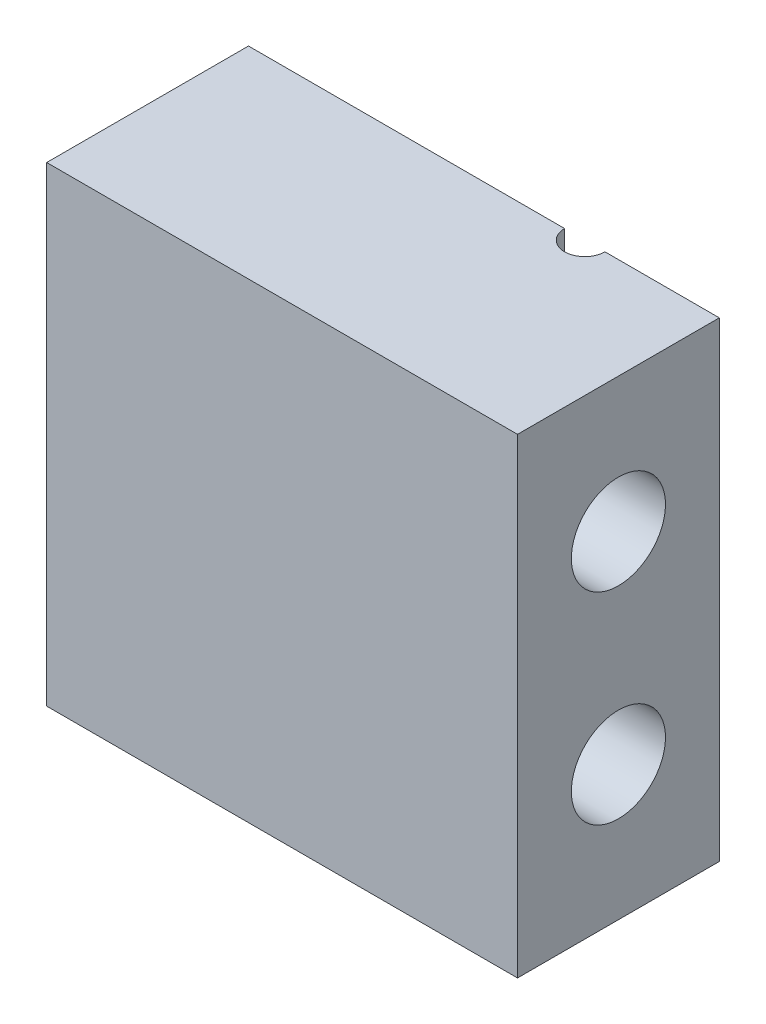
ISO-10303-21;
HEADER;
FILE_DESCRIPTION(('STEP AP214'),'2;1');
FILE_NAME('part.step','',(''),(''),'','','');
FILE_SCHEMA(('AUTOMOTIVE_DESIGN { 1 0 10303 214 1 1 1 1 }'));
ENDSEC;
DATA;
#1=APPLICATION_CONTEXT('core data for automotive mechanical design processes');
#2=APPLICATION_PROTOCOL_DEFINITION('international standard','automotive_design',2000,#1);
#3=PRODUCT_CONTEXT('',#1,'mechanical');
#4=PRODUCT('Part','Part','',(#3));
#5=PRODUCT_RELATED_PRODUCT_CATEGORY('part','',(#4));
#6=PRODUCT_DEFINITION_FORMATION('','',#4);
#7=PRODUCT_DEFINITION_CONTEXT('part definition',#1,'design');
#8=PRODUCT_DEFINITION('design','',#6,#7);
#9=PRODUCT_DEFINITION_SHAPE('','',#8);
#10=(LENGTH_UNIT() NAMED_UNIT(*) SI_UNIT(.MILLI.,.METRE.));
#11=(NAMED_UNIT(*) PLANE_ANGLE_UNIT() SI_UNIT($,.RADIAN.));
#12=(NAMED_UNIT(*) SI_UNIT($,.STERADIAN.) SOLID_ANGLE_UNIT());
#13=UNCERTAINTY_MEASURE_WITH_UNIT(LENGTH_MEASURE(1.E-05),#10,'distance_accuracy_value','');
#14=(GEOMETRIC_REPRESENTATION_CONTEXT(3) GLOBAL_UNCERTAINTY_ASSIGNED_CONTEXT((#13)) GLOBAL_UNIT_ASSIGNED_CONTEXT((#10,
#11,#12)) REPRESENTATION_CONTEXT('',''));
#15=CARTESIAN_POINT('',(0.,0.,0.));
#16=DIRECTION('',(0.,0.,1.));
#17=DIRECTION('',(1.,0.,0.));
#18=AXIS2_PLACEMENT_3D('',#15,#16,#17);
#19=CARTESIAN_POINT('',(0.,8.89,0.));
#20=DIRECTION('',(1.,0.,0.));
#21=DIRECTION('',(0.,0.,-1.));
#22=AXIS2_PLACEMENT_3D('',#19,#20,#21);
#23=PLANE('',#22);
#24=DIRECTION('',(0.,0.,1.));
#25=VECTOR('',#24,1.);
#26=CARTESIAN_POINT('',(0.,0.,0.));
#27=LINE('',#26,#25);
#28=CARTESIAN_POINT('',(0.,0.,-3.81));
#29=VERTEX_POINT('',#28);
#30=CARTESIAN_POINT('',(0.,0.,0.));
#31=VERTEX_POINT('',#30);
#32=EDGE_CURVE('E133',#29,#31,#27,.T.);
#33=ORIENTED_EDGE('',*,*,#32,.T.);
#34=DIRECTION('',(0.,-1.,0.));
#35=VECTOR('',#34,1.);
#36=CARTESIAN_POINT('',(0.,8.89,0.));
#37=LINE('',#36,#35);
#38=CARTESIAN_POINT('',(0.,8.89,0.));
#39=VERTEX_POINT('',#38);
#40=EDGE_CURVE('E11',#39,#31,#37,.T.);
#41=ORIENTED_EDGE('',*,*,#40,.F.);
#42=DIRECTION('',(0.,0.,1.));
#43=VECTOR('',#42,1.);
#44=CARTESIAN_POINT('',(0.,8.89,0.));
#45=LINE('',#44,#43);
#46=CARTESIAN_POINT('',(0.,8.89,-3.81));
#47=VERTEX_POINT('',#46);
#48=EDGE_CURVE('E150',#47,#39,#45,.T.);
#49=ORIENTED_EDGE('',*,*,#48,.F.);
#50=DIRECTION('',(0.,-1.,0.));
#51=VECTOR('',#50,1.);
#52=CARTESIAN_POINT('',(0.,8.89,-3.81));
#53=LINE('',#52,#51);
#54=EDGE_CURVE('E129',#47,#29,#53,.T.);
#55=ORIENTED_EDGE('',*,*,#54,.T.);
#56=EDGE_LOOP('',(#33,#41,#49,#55));
#57=FACE_BOUND('',#56,.T.);
#58=ADVANCED_FACE('F41',(#57),#23,.F.);
#59=CARTESIAN_POINT('',(0.,8.89,0.));
#60=DIRECTION('',(0.,0.,-1.));
#61=DIRECTION('',(-1.,0.,0.));
#62=AXIS2_PLACEMENT_3D('',#59,#60,#61);
#63=PLANE('',#62);
#64=DIRECTION('',(1.,0.,0.));
#65=VECTOR('',#64,1.);
#66=CARTESIAN_POINT('',(0.,0.,0.));
#67=LINE('',#66,#65);
#68=CARTESIAN_POINT('',(8.89,0.,0.));
#69=VERTEX_POINT('',#68);
#70=EDGE_CURVE('E137',#31,#69,#67,.T.);
#71=ORIENTED_EDGE('',*,*,#70,.T.);
#72=DIRECTION('',(0.,-1.,0.));
#73=VECTOR('',#72,1.);
#74=CARTESIAN_POINT('',(8.89,8.89,0.));
#75=LINE('',#74,#73);
#76=CARTESIAN_POINT('',(8.89,8.89,0.));
#77=VERTEX_POINT('',#76);
#78=EDGE_CURVE('E50',#77,#69,#75,.T.);
#79=ORIENTED_EDGE('',*,*,#78,.F.);
#80=DIRECTION('',(1.,0.,0.));
#81=VECTOR('',#80,1.);
#82=CARTESIAN_POINT('',(0.,8.89,0.));
#83=LINE('',#82,#81);
#84=EDGE_CURVE('E96',#39,#77,#83,.T.);
#85=ORIENTED_EDGE('',*,*,#84,.F.);
#86=ORIENTED_EDGE('',*,*,#40,.T.);
#87=EDGE_LOOP('',(#71,#79,#85,#86));
#88=FACE_BOUND('',#87,.T.);
#89=ADVANCED_FACE('F181',(#88),#63,.F.);
#90=CARTESIAN_POINT('',(8.89,8.89,0.));
#91=DIRECTION('',(-1.,0.,0.));
#92=DIRECTION('',(0.,0.,1.));
#93=AXIS2_PLACEMENT_3D('',#90,#91,#92);
#94=PLANE('',#93);
#95=CARTESIAN_POINT('',(8.89,2.54,-1.905));
#96=DIRECTION('',(1.,0.,0.));
#97=DIRECTION('',(0.,0.,-1.));
#98=AXIS2_PLACEMENT_3D('',#95,#96,#97);
#99=CIRCLE('',#98,0.889);
#100=CARTESIAN_POINT('',(8.89,2.54,-2.794));
#101=VERTEX_POINT('',#100);
#102=EDGE_CURVE('E330',#101,#101,#99,.T.);
#103=ORIENTED_EDGE('',*,*,#102,.F.);
#104=EDGE_LOOP('',(#103));
#105=FACE_BOUND('',#104,.T.);
#106=CARTESIAN_POINT('',(8.89,6.35,-1.905));
#107=DIRECTION('',(1.,0.,0.));
#108=DIRECTION('',(0.,0.,-1.));
#109=AXIS2_PLACEMENT_3D('',#106,#107,#108);
#110=CIRCLE('',#109,0.888999999999999);
#111=CARTESIAN_POINT('',(8.89,6.35,-2.794));
#112=VERTEX_POINT('',#111);
#113=EDGE_CURVE('E334',#112,#112,#110,.T.);
#114=ORIENTED_EDGE('',*,*,#113,.F.);
#115=EDGE_LOOP('',(#114));
#116=FACE_BOUND('',#115,.T.);
#117=DIRECTION('',(0.,0.,-1.));
#118=VECTOR('',#117,1.);
#119=CARTESIAN_POINT('',(8.89,0.,0.));
#120=LINE('',#119,#118);
#121=CARTESIAN_POINT('',(8.89,0.,-3.81));
#122=VERTEX_POINT('',#121);
#123=EDGE_CURVE('E141',#69,#122,#120,.T.);
#124=ORIENTED_EDGE('',*,*,#123,.T.);
#125=DIRECTION('',(0.,-1.,0.));
#126=VECTOR('',#125,1.);
#127=CARTESIAN_POINT('',(8.89,8.89,-3.81));
#128=LINE('',#127,#126);
#129=CARTESIAN_POINT('',(8.89,8.89,-3.81));
#130=VERTEX_POINT('',#129);
#131=EDGE_CURVE('E122',#130,#122,#128,.T.);
#132=ORIENTED_EDGE('',*,*,#131,.F.);
#133=DIRECTION('',(0.,0.,-1.));
#134=VECTOR('',#133,1.);
#135=CARTESIAN_POINT('',(8.89,8.89,0.));
#136=LINE('',#135,#134);
#137=EDGE_CURVE('E111',#77,#130,#136,.T.);
#138=ORIENTED_EDGE('',*,*,#137,.F.);
#139=ORIENTED_EDGE('',*,*,#78,.T.);
#140=EDGE_LOOP('',(#124,#132,#138,#139));
#141=FACE_BOUND('',#140,.T.);
#142=ADVANCED_FACE('F160',(#105,#116,#141),#94,.F.);
#143=CARTESIAN_POINT('',(6.731,8.89,-3.81));
#144=DIRECTION('',(0.,0.,1.));
#145=DIRECTION('',(1.,0.,0.));
#146=AXIS2_PLACEMENT_3D('',#143,#144,#145);
#147=PLANE('',#146);
#148=DIRECTION('',(-1.,0.,0.));
#149=VECTOR('',#148,1.);
#150=CARTESIAN_POINT('',(6.731,0.,-3.81));
#151=LINE('',#150,#149);
#152=CARTESIAN_POINT('',(6.731,0.,-3.81));
#153=VERTEX_POINT('',#152);
#154=EDGE_CURVE('E120',#122,#153,#151,.T.);
#155=ORIENTED_EDGE('',*,*,#154,.T.);
#156=DIRECTION('',(0.,-1.,0.));
#157=VECTOR('',#156,1.);
#158=CARTESIAN_POINT('',(6.731,8.89,-3.81));
#159=LINE('',#158,#157);
#160=CARTESIAN_POINT('',(6.731,8.89,-3.81));
#161=VERTEX_POINT('',#160);
#162=EDGE_CURVE('E117',#161,#153,#159,.T.);
#163=ORIENTED_EDGE('',*,*,#162,.F.);
#164=DIRECTION('',(-1.,0.,0.));
#165=VECTOR('',#164,1.);
#166=CARTESIAN_POINT('',(6.731,8.89,-3.81));
#167=LINE('',#166,#165);
#168=EDGE_CURVE('E105',#130,#161,#167,.T.);
#169=ORIENTED_EDGE('',*,*,#168,.F.);
#170=ORIENTED_EDGE('',*,*,#131,.T.);
#171=EDGE_LOOP('',(#155,#163,#169,#170));
#172=FACE_BOUND('',#171,.T.);
#173=ADVANCED_FACE('F118',(#172),#147,.F.);
#174=CARTESIAN_POINT('',(6.35,8.89,-3.81));
#175=DIRECTION('',(0.,-1.,0.));
#176=DIRECTION('',(0.,0.,-1.));
#177=AXIS2_PLACEMENT_3D('',#174,#175,#176);
#178=CYLINDRICAL_SURFACE('',#177,0.381000000000001);
#179=CARTESIAN_POINT('',(6.35,0.,-3.81));
#180=DIRECTION('',(0.,-1.,0.));
#181=DIRECTION('',(0.,0.,1.));
#182=AXIS2_PLACEMENT_3D('',#179,#180,#181);
#183=CIRCLE('',#182,0.381000000000001);
#184=CARTESIAN_POINT('',(5.969,0.,-3.81));
#185=VERTEX_POINT('',#184);
#186=EDGE_CURVE('E82',#153,#185,#183,.T.);
#187=ORIENTED_EDGE('',*,*,#186,.T.);
#188=DIRECTION('',(0.,-1.,0.));
#189=VECTOR('',#188,1.);
#190=CARTESIAN_POINT('',(5.969,8.89,-3.81));
#191=LINE('',#190,#189);
#192=CARTESIAN_POINT('',(5.969,8.89,-3.81));
#193=VERTEX_POINT('',#192);
#194=EDGE_CURVE('E123',#193,#185,#191,.T.);
#195=ORIENTED_EDGE('',*,*,#194,.F.);
#196=CARTESIAN_POINT('',(6.35,8.89,-3.81));
#197=DIRECTION('',(0.,-1.,0.));
#198=DIRECTION('',(0.,0.,1.));
#199=AXIS2_PLACEMENT_3D('',#196,#197,#198);
#200=CIRCLE('',#199,0.381000000000001);
#201=EDGE_CURVE('E109',#161,#193,#200,.T.);
#202=ORIENTED_EDGE('',*,*,#201,.F.);
#203=ORIENTED_EDGE('',*,*,#162,.T.);
#204=EDGE_LOOP('',(#187,#195,#202,#203));
#205=FACE_BOUND('',#204,.T.);
#206=ADVANCED_FACE('F125',(#205),#178,.F.);
#207=CARTESIAN_POINT('',(0.,8.89,-3.81));
#208=DIRECTION('',(0.,0.,1.));
#209=DIRECTION('',(1.,0.,0.));
#210=AXIS2_PLACEMENT_3D('',#207,#208,#209);
#211=PLANE('',#210);
#212=CARTESIAN_POINT('',(2.032,2.54,-3.81));
#213=DIRECTION('',(0.,0.,-1.));
#214=DIRECTION('',(-1.,0.,0.));
#215=AXIS2_PLACEMENT_3D('',#212,#213,#214);
#216=CIRCLE('',#215,0.888999999999999);
#217=CARTESIAN_POINT('',(1.143,2.54,-3.81));
#218=VERTEX_POINT('',#217);
#219=EDGE_CURVE('E344',#218,#218,#216,.T.);
#220=ORIENTED_EDGE('',*,*,#219,.F.);
#221=EDGE_LOOP('',(#220));
#222=FACE_BOUND('',#221,.T.);
#223=CARTESIAN_POINT('',(2.032,6.35,-3.81));
#224=DIRECTION('',(0.,0.,-1.));
#225=DIRECTION('',(-1.,0.,0.));
#226=AXIS2_PLACEMENT_3D('',#223,#224,#225);
#227=CIRCLE('',#226,0.888999999999999);
#228=CARTESIAN_POINT('',(1.143,6.35,-3.81));
#229=VERTEX_POINT('',#228);
#230=EDGE_CURVE('E352',#229,#229,#227,.T.);
#231=ORIENTED_EDGE('',*,*,#230,.F.);
#232=EDGE_LOOP('',(#231));
#233=FACE_BOUND('',#232,.T.);
#234=DIRECTION('',(-1.,0.,0.));
#235=VECTOR('',#234,1.);
#236=CARTESIAN_POINT('',(0.,0.,-3.81));
#237=LINE('',#236,#235);
#238=EDGE_CURVE('E88',#185,#29,#237,.T.);
#239=ORIENTED_EDGE('',*,*,#238,.T.);
#240=ORIENTED_EDGE('',*,*,#54,.F.);
#241=DIRECTION('',(-1.,0.,0.));
#242=VECTOR('',#241,1.);
#243=CARTESIAN_POINT('',(0.,8.89,-3.81));
#244=LINE('',#243,#242);
#245=EDGE_CURVE('E58',#193,#47,#244,.T.);
#246=ORIENTED_EDGE('',*,*,#245,.F.);
#247=ORIENTED_EDGE('',*,*,#194,.T.);
#248=EDGE_LOOP('',(#239,#240,#246,#247));
#249=FACE_BOUND('',#248,.T.);
#250=ADVANCED_FACE('F167',(#222,#233,#249),#211,.F.);
#251=CARTESIAN_POINT('',(6.35,8.89,-3.81));
#252=DIRECTION('',(0.,1.,0.));
#253=DIRECTION('',(0.,0.,1.));
#254=AXIS2_PLACEMENT_3D('',#251,#252,#253);
#255=PLANE('',#254);
#256=ORIENTED_EDGE('',*,*,#48,.T.);
#257=ORIENTED_EDGE('',*,*,#84,.T.);
#258=ORIENTED_EDGE('',*,*,#137,.T.);
#259=ORIENTED_EDGE('',*,*,#168,.T.);
#260=ORIENTED_EDGE('',*,*,#201,.T.);
#261=ORIENTED_EDGE('',*,*,#245,.T.);
#262=EDGE_LOOP('',(#256,#257,#258,#259,#260,#261));
#263=FACE_BOUND('',#262,.T.);
#264=ADVANCED_FACE('F107',(#263),#255,.T.);
#265=CARTESIAN_POINT('',(6.35,0.,-3.81));
#266=DIRECTION('',(0.,1.,0.));
#267=DIRECTION('',(0.,0.,1.));
#268=AXIS2_PLACEMENT_3D('',#265,#266,#267);
#269=PLANE('',#268);
#270=ORIENTED_EDGE('',*,*,#32,.F.);
#271=ORIENTED_EDGE('',*,*,#238,.F.);
#272=ORIENTED_EDGE('',*,*,#186,.F.);
#273=ORIENTED_EDGE('',*,*,#154,.F.);
#274=ORIENTED_EDGE('',*,*,#123,.F.);
#275=ORIENTED_EDGE('',*,*,#70,.F.);
#276=EDGE_LOOP('',(#270,#271,#272,#273,#274,#275));
#277=FACE_BOUND('',#276,.T.);
#278=ADVANCED_FACE('F163',(#277),#269,.F.);
#279=CARTESIAN_POINT('',(2.032,6.35,-1.27));
#280=DIRECTION('',(0.,0.,-1.));
#281=DIRECTION('',(-1.,0.,0.));
#282=AXIS2_PLACEMENT_3D('',#279,#280,#281);
#283=CONICAL_SURFACE('',#282,0.888999999999999,1.02974425867665);
#284=CARTESIAN_POINT('',(2.032,6.35,-0.735834909684498));
#285=VERTEX_POINT('',#284);
#286=VERTEX_LOOP('',#285);
#287=FACE_BOUND('',#286,.T.);
#288=CARTESIAN_POINT('',(2.032,6.35,-1.27));
#289=DIRECTION('',(0.,0.,-1.));
#290=DIRECTION('',(-1.,0.,0.));
#291=AXIS2_PLACEMENT_3D('',#288,#289,#290);
#292=CIRCLE('',#291,0.888999999999999);
#293=CARTESIAN_POINT('',(1.143,6.35,-1.27));
#294=VERTEX_POINT('',#293);
#295=EDGE_CURVE('E138',#294,#294,#292,.T.);
#296=ORIENTED_EDGE('',*,*,#295,.T.);
#297=EDGE_LOOP('',(#296));
#298=FACE_BOUND('',#297,.T.);
#299=ADVANCED_FACE('F215',(#287,#298),#283,.F.);
#300=CARTESIAN_POINT('',(2.032,6.35,-3.81));
#301=DIRECTION('',(0.,0.,-1.));
#302=DIRECTION('',(-1.,0.,0.));
#303=AXIS2_PLACEMENT_3D('',#300,#301,#302);
#304=CYLINDRICAL_SURFACE('',#303,0.888999999999999);
#305=ORIENTED_EDGE('',*,*,#295,.F.);
#306=EDGE_LOOP('',(#305));
#307=FACE_BOUND('',#306,.T.);
#308=ORIENTED_EDGE('',*,*,#230,.T.);
#309=EDGE_LOOP('',(#308));
#310=FACE_BOUND('',#309,.T.);
#311=ADVANCED_FACE('F232',(#307,#310),#304,.F.);
#312=CARTESIAN_POINT('',(2.032,2.54,-1.27));
#313=DIRECTION('',(0.,0.,-1.));
#314=DIRECTION('',(-1.,0.,0.));
#315=AXIS2_PLACEMENT_3D('',#312,#313,#314);
#316=CONICAL_SURFACE('',#315,0.888999999999999,1.02974425867665);
#317=CARTESIAN_POINT('',(2.032,2.54,-0.735834909684498));
#318=VERTEX_POINT('',#317);
#319=VERTEX_LOOP('',#318);
#320=FACE_BOUND('',#319,.T.);
#321=CARTESIAN_POINT('',(2.032,2.54,-1.27));
#322=DIRECTION('',(0.,0.,-1.));
#323=DIRECTION('',(-1.,0.,0.));
#324=AXIS2_PLACEMENT_3D('',#321,#322,#323);
#325=CIRCLE('',#324,0.888999999999999);
#326=CARTESIAN_POINT('',(1.143,2.54,-1.27));
#327=VERTEX_POINT('',#326);
#328=EDGE_CURVE('E348',#327,#327,#325,.T.);
#329=ORIENTED_EDGE('',*,*,#328,.T.);
#330=EDGE_LOOP('',(#329));
#331=FACE_BOUND('',#330,.T.);
#332=ADVANCED_FACE('F243',(#320,#331),#316,.F.);
#333=CARTESIAN_POINT('',(2.032,2.54,-3.81));
#334=DIRECTION('',(0.,0.,-1.));
#335=DIRECTION('',(-1.,0.,0.));
#336=AXIS2_PLACEMENT_3D('',#333,#334,#335);
#337=CYLINDRICAL_SURFACE('',#336,0.888999999999999);
#338=ORIENTED_EDGE('',*,*,#328,.F.);
#339=EDGE_LOOP('',(#338));
#340=FACE_BOUND('',#339,.T.);
#341=ORIENTED_EDGE('',*,*,#219,.T.);
#342=EDGE_LOOP('',(#341));
#343=FACE_BOUND('',#342,.T.);
#344=ADVANCED_FACE('F255',(#340,#343),#337,.F.);
#345=CARTESIAN_POINT('',(6.35,6.35,-1.905));
#346=DIRECTION('',(1.,0.,0.));
#347=DIRECTION('',(0.,0.,-1.));
#348=AXIS2_PLACEMENT_3D('',#345,#346,#347);
#349=CONICAL_SURFACE('',#348,0.888999999999999,1.02974425867665);
#350=CARTESIAN_POINT('',(5.8158349096845,6.35,-1.905));
#351=VERTEX_POINT('',#350);
#352=VERTEX_LOOP('',#351);
#353=FACE_BOUND('',#352,.T.);
#354=CARTESIAN_POINT('',(6.35,6.35,-1.905));
#355=DIRECTION('',(1.,0.,0.));
#356=DIRECTION('',(0.,0.,-1.));
#357=AXIS2_PLACEMENT_3D('',#354,#355,#356);
#358=CIRCLE('',#357,0.888999999999999);
#359=CARTESIAN_POINT('',(6.35,6.35,-2.794));
#360=VERTEX_POINT('',#359);
#361=EDGE_CURVE('E340',#360,#360,#358,.T.);
#362=ORIENTED_EDGE('',*,*,#361,.T.);
#363=EDGE_LOOP('',(#362));
#364=FACE_BOUND('',#363,.T.);
#365=ADVANCED_FACE('F265',(#353,#364),#349,.F.);
#366=CARTESIAN_POINT('',(8.89,6.35,-1.905));
#367=DIRECTION('',(1.,0.,0.));
#368=DIRECTION('',(0.,0.,-1.));
#369=AXIS2_PLACEMENT_3D('',#366,#367,#368);
#370=CYLINDRICAL_SURFACE('',#369,0.888999999999999);
#371=ORIENTED_EDGE('',*,*,#361,.F.);
#372=EDGE_LOOP('',(#371));
#373=FACE_BOUND('',#372,.T.);
#374=ORIENTED_EDGE('',*,*,#113,.T.);
#375=EDGE_LOOP('',(#374));
#376=FACE_BOUND('',#375,.T.);
#377=ADVANCED_FACE('F275',(#373,#376),#370,.F.);
#378=CARTESIAN_POINT('',(6.35,2.54,-1.905));
#379=DIRECTION('',(1.,0.,0.));
#380=DIRECTION('',(0.,0.,-1.));
#381=AXIS2_PLACEMENT_3D('',#378,#379,#380);
#382=CONICAL_SURFACE('',#381,0.888999999999999,1.02974425867665);
#383=CARTESIAN_POINT('',(5.8158349096845,2.54,-1.905));
#384=VERTEX_POINT('',#383);
#385=VERTEX_LOOP('',#384);
#386=FACE_BOUND('',#385,.T.);
#387=CARTESIAN_POINT('',(6.35,2.54,-1.905));
#388=DIRECTION('',(1.,0.,0.));
#389=DIRECTION('',(0.,0.,-1.));
#390=AXIS2_PLACEMENT_3D('',#387,#388,#389);
#391=CIRCLE('',#390,0.888999999999999);
#392=CARTESIAN_POINT('',(6.35,2.54,-2.794));
#393=VERTEX_POINT('',#392);
#394=EDGE_CURVE('E327',#393,#393,#391,.T.);
#395=ORIENTED_EDGE('',*,*,#394,.T.);
#396=EDGE_LOOP('',(#395));
#397=FACE_BOUND('',#396,.T.);
#398=ADVANCED_FACE('F285',(#386,#397),#382,.F.);
#399=CARTESIAN_POINT('',(8.89,2.54,-1.905));
#400=DIRECTION('',(1.,0.,0.));
#401=DIRECTION('',(0.,0.,-1.));
#402=AXIS2_PLACEMENT_3D('',#399,#400,#401);
#403=CYLINDRICAL_SURFACE('',#402,0.888999999999999);
#404=ORIENTED_EDGE('',*,*,#394,.F.);
#405=EDGE_LOOP('',(#404));
#406=FACE_BOUND('',#405,.T.);
#407=ORIENTED_EDGE('',*,*,#102,.T.);
#408=EDGE_LOOP('',(#407));
#409=FACE_BOUND('',#408,.T.);
#410=ADVANCED_FACE('F296',(#406,#409),#403,.F.);
#411=CLOSED_SHELL('',(#58,#89,#142,#173,#206,#250,#264,#278,#299,#311,#332,#344,#365,#377,#398,#410));
#412=MANIFOLD_SOLID_BREP('B2',#411);
#413=ADVANCED_BREP_SHAPE_REPRESENTATION('',(#18,#412),#14);
#414=SHAPE_DEFINITION_REPRESENTATION(#9,#413);
ENDSEC;
END-ISO-10303-21;
